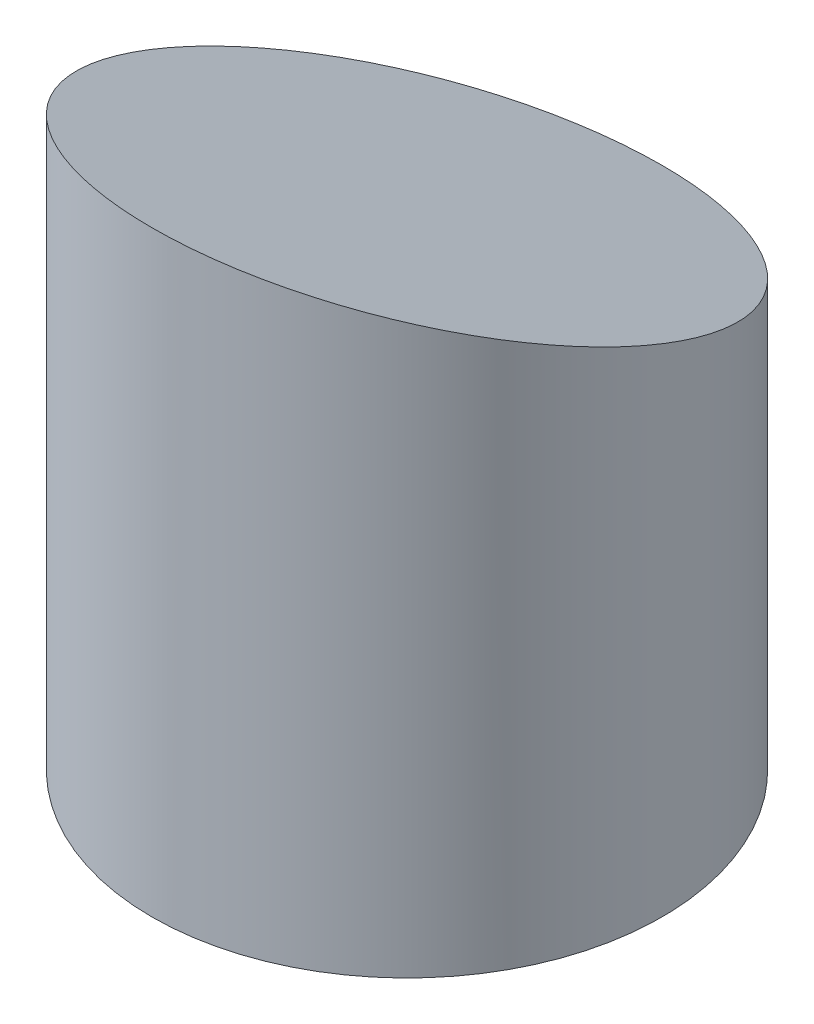
ISO-10303-21;
HEADER;
FILE_DESCRIPTION(('STEP AP214'),'2;1');
FILE_NAME('part.step','',(''),(''),'','','');
FILE_SCHEMA(('AUTOMOTIVE_DESIGN { 1 0 10303 214 1 1 1 1 }'));
ENDSEC;
DATA;
#1=APPLICATION_CONTEXT('core data for automotive mechanical design processes');
#2=APPLICATION_PROTOCOL_DEFINITION('international standard','automotive_design',2000,#1);
#3=PRODUCT_CONTEXT('',#1,'mechanical');
#4=PRODUCT('Part','Part','',(#3));
#5=PRODUCT_RELATED_PRODUCT_CATEGORY('part','',(#4));
#6=PRODUCT_DEFINITION_FORMATION('','',#4);
#7=PRODUCT_DEFINITION_CONTEXT('part definition',#1,'design');
#8=PRODUCT_DEFINITION('design','',#6,#7);
#9=PRODUCT_DEFINITION_SHAPE('','',#8);
#10=(LENGTH_UNIT() NAMED_UNIT(*) SI_UNIT(.MILLI.,.METRE.));
#11=(NAMED_UNIT(*) PLANE_ANGLE_UNIT() SI_UNIT($,.RADIAN.));
#12=(NAMED_UNIT(*) SI_UNIT($,.STERADIAN.) SOLID_ANGLE_UNIT());
#13=UNCERTAINTY_MEASURE_WITH_UNIT(LENGTH_MEASURE(1.E-05),#10,'distance_accuracy_value','');
#14=(GEOMETRIC_REPRESENTATION_CONTEXT(3) GLOBAL_UNCERTAINTY_ASSIGNED_CONTEXT((#13)) GLOBAL_UNIT_ASSIGNED_CONTEXT((#10,
#11,#12)) REPRESENTATION_CONTEXT('',''));
#15=CARTESIAN_POINT('',(0.,0.,0.));
#16=DIRECTION('',(0.,0.,1.));
#17=DIRECTION('',(1.,0.,0.));
#18=AXIS2_PLACEMENT_3D('',#15,#16,#17);
#19=CARTESIAN_POINT('',(0.,123.,0.));
#20=DIRECTION('',(0.,-1.,0.));
#21=DIRECTION('',(0.,0.,-1.));
#22=AXIS2_PLACEMENT_3D('',#19,#20,#21);
#23=CYLINDRICAL_SURFACE('',#22,52.55);
#24=CARTESIAN_POINT('',(0.,0.,0.));
#25=DIRECTION('',(0.,1.,0.));
#26=DIRECTION('',(0.,0.,1.));
#27=AXIS2_PLACEMENT_3D('',#24,#25,#26);
#28=CIRCLE('',#27,52.55);
#29=CARTESIAN_POINT('',(0.,0.,52.55));
#30=VERTEX_POINT('',#29);
#31=EDGE_CURVE('E10',#30,#30,#28,.T.);
#32=ORIENTED_EDGE('',*,*,#31,.T.);
#33=EDGE_LOOP('',(#32));
#34=FACE_BOUND('',#33,.T.);
#35=CARTESIAN_POINT('',(0.,102.300004506435,0.));
#36=DIRECTION('',(5.86972348504133E-09,0.930417567982024,-0.366501226724298));
#37=DIRECTION('',(1.49011611734315E-08,-0.366501226724298,-0.930417567982024));
#38=AXIS2_PLACEMENT_3D('',#35,#36,#37);
#39=ELLIPSE('',#38,56.4800169390345,52.55);
#40=CARTESIAN_POINT('',(8.41617835486695E-07,81.6000090128695,-52.55));
#41=VERTEX_POINT('',#40);
#42=EDGE_CURVE('E40',#41,#41,#39,.T.);
#43=ORIENTED_EDGE('',*,*,#42,.F.);
#44=EDGE_LOOP('',(#43));
#45=FACE_BOUND('',#44,.T.);
#46=ADVANCED_FACE('F34',(#34,#45),#23,.T.);
#47=CARTESIAN_POINT('',(0.,0.,0.));
#48=DIRECTION('',(0.,1.,0.));
#49=DIRECTION('',(0.,0.,1.));
#50=AXIS2_PLACEMENT_3D('',#47,#48,#49);
#51=PLANE('',#50);
#52=ORIENTED_EDGE('',*,*,#31,.F.);
#53=EDGE_LOOP('',(#52));
#54=FACE_BOUND('',#53,.T.);
#55=ADVANCED_FACE('F49',(#54),#51,.F.);
#56=CARTESIAN_POINT('',(5.5869038543314E-07,88.5587457389368,-34.8842176538874));
#57=DIRECTION('',(5.86972348504133E-09,0.930417567982024,-0.366501226724298));
#58=DIRECTION('',(0.,0.366501226724298,0.930417567982024));
#59=AXIS2_PLACEMENT_3D('',#56,#57,#58);
#60=PLANE('',#59);
#61=ORIENTED_EDGE('',*,*,#42,.T.);
#62=EDGE_LOOP('',(#61));
#63=FACE_BOUND('',#62,.T.);
#64=ADVANCED_FACE('F46',(#63),#60,.T.);
#65=CLOSED_SHELL('',(#46,#55,#64));
#66=MANIFOLD_SOLID_BREP('B2',#65);
#67=ADVANCED_BREP_SHAPE_REPRESENTATION('',(#18,#66),#14);
#68=SHAPE_DEFINITION_REPRESENTATION(#9,#67);
ENDSEC;
END-ISO-10303-21;
